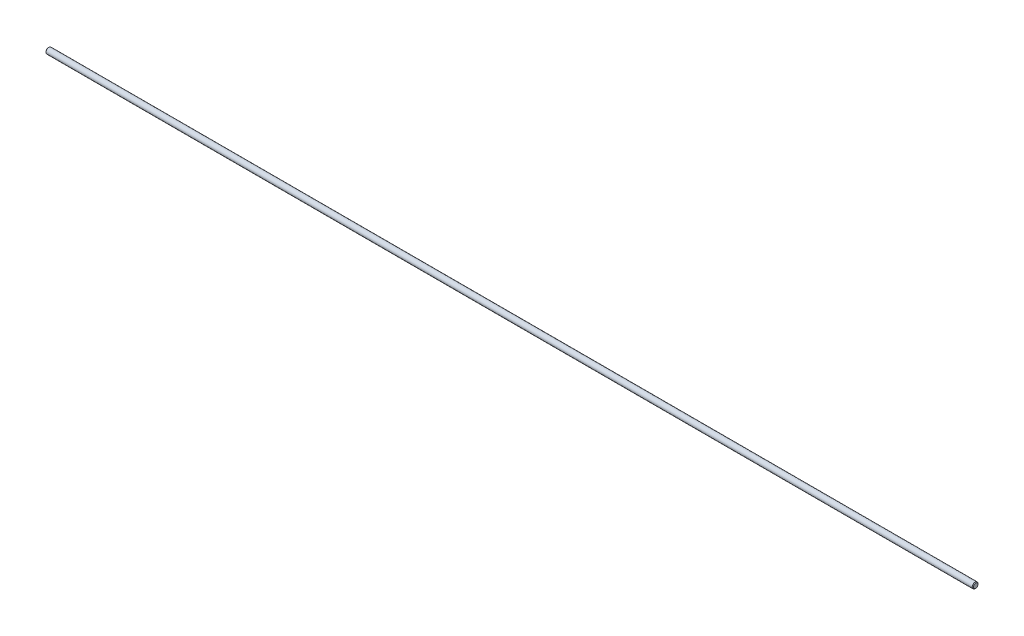
ISO-10303-21;
HEADER;
FILE_DESCRIPTION(('STEP AP214'),'2;1');
FILE_NAME('part.step','',(''),(''),'','','');
FILE_SCHEMA(('AUTOMOTIVE_DESIGN { 1 0 10303 214 1 1 1 1 }'));
ENDSEC;
DATA;
#1=APPLICATION_CONTEXT('core data for automotive mechanical design processes');
#2=APPLICATION_PROTOCOL_DEFINITION('international standard','automotive_design',2000,#1);
#3=PRODUCT_CONTEXT('',#1,'mechanical');
#4=PRODUCT('Part','Part','',(#3));
#5=PRODUCT_RELATED_PRODUCT_CATEGORY('part','',(#4));
#6=PRODUCT_DEFINITION_FORMATION('','',#4);
#7=PRODUCT_DEFINITION_CONTEXT('part definition',#1,'design');
#8=PRODUCT_DEFINITION('design','',#6,#7);
#9=PRODUCT_DEFINITION_SHAPE('','',#8);
#10=(LENGTH_UNIT() NAMED_UNIT(*) SI_UNIT(.MILLI.,.METRE.));
#11=(NAMED_UNIT(*) PLANE_ANGLE_UNIT() SI_UNIT($,.RADIAN.));
#12=(NAMED_UNIT(*) SI_UNIT($,.STERADIAN.) SOLID_ANGLE_UNIT());
#13=UNCERTAINTY_MEASURE_WITH_UNIT(LENGTH_MEASURE(1.E-05),#10,'distance_accuracy_value','');
#14=(GEOMETRIC_REPRESENTATION_CONTEXT(3) GLOBAL_UNCERTAINTY_ASSIGNED_CONTEXT((#13)) GLOBAL_UNIT_ASSIGNED_CONTEXT((#10,
#11,#12)) REPRESENTATION_CONTEXT('',''));
#15=CARTESIAN_POINT('',(0.,0.,0.));
#16=DIRECTION('',(0.,0.,1.));
#17=DIRECTION('',(1.,0.,0.));
#18=AXIS2_PLACEMENT_3D('',#15,#16,#17);
#19=CARTESIAN_POINT('',(-762.,0.,0.));
#20=DIRECTION('',(1.,0.,0.));
#21=DIRECTION('',(0.,0.,-1.));
#22=AXIS2_PLACEMENT_3D('',#19,#20,#21);
#23=CYLINDRICAL_SURFACE('',#22,4.7625);
#24=CARTESIAN_POINT('',(761.0475,0.,0.));
#25=DIRECTION('',(1.,0.,0.));
#26=DIRECTION('',(0.,0.,-1.));
#27=AXIS2_PLACEMENT_3D('',#24,#25,#26);
#28=CIRCLE('',#27,4.7625);
#29=CARTESIAN_POINT('',(761.0475,0.,4.76250000000006));
#30=VERTEX_POINT('',#29);
#31=EDGE_CURVE('E36',#30,#30,#28,.F.);
#32=ORIENTED_EDGE('',*,*,#31,.T.);
#33=EDGE_LOOP('',(#32));
#34=FACE_BOUND('',#33,.T.);
#35=CARTESIAN_POINT('',(-761.0475,0.,0.));
#36=DIRECTION('',(1.,0.,0.));
#37=DIRECTION('',(0.,0.,-1.));
#38=AXIS2_PLACEMENT_3D('',#35,#36,#37);
#39=CIRCLE('',#38,4.7625);
#40=CARTESIAN_POINT('',(-761.0475,0.,-4.7625));
#41=VERTEX_POINT('',#40);
#42=EDGE_CURVE('E40',#41,#41,#39,.T.);
#43=ORIENTED_EDGE('',*,*,#42,.T.);
#44=EDGE_LOOP('',(#43));
#45=FACE_BOUND('',#44,.T.);
#46=ADVANCED_FACE('F29',(#34,#45),#23,.T.);
#47=CARTESIAN_POINT('',(-762.,0.,0.));
#48=DIRECTION('',(1.,0.,0.));
#49=DIRECTION('',(0.,0.,-1.));
#50=AXIS2_PLACEMENT_3D('',#47,#48,#49);
#51=PLANE('',#50);
#52=CARTESIAN_POINT('',(-762.,0.,0.));
#53=DIRECTION('',(1.,0.,0.));
#54=DIRECTION('',(0.,0.,-1.));
#55=AXIS2_PLACEMENT_3D('',#52,#53,#54);
#56=CIRCLE('',#55,3.81000000000009);
#57=CARTESIAN_POINT('',(-762.,0.,-3.81000000000009));
#58=VERTEX_POINT('',#57);
#59=EDGE_CURVE('E10',#58,#58,#56,.F.);
#60=ORIENTED_EDGE('',*,*,#59,.T.);
#61=EDGE_LOOP('',(#60));
#62=FACE_BOUND('',#61,.T.);
#63=ADVANCED_FACE('F60',(#62),#51,.F.);
#64=CARTESIAN_POINT('',(762.,0.,0.));
#65=DIRECTION('',(1.,0.,0.));
#66=DIRECTION('',(0.,0.,-1.));
#67=AXIS2_PLACEMENT_3D('',#64,#65,#66);
#68=PLANE('',#67);
#69=CARTESIAN_POINT('',(762.,0.,0.));
#70=DIRECTION('',(1.,0.,0.));
#71=DIRECTION('',(0.,0.,-1.));
#72=AXIS2_PLACEMENT_3D('',#69,#70,#71);
#73=CIRCLE('',#72,3.80999999999987);
#74=CARTESIAN_POINT('',(762.,0.,3.80999999999992));
#75=VERTEX_POINT('',#74);
#76=EDGE_CURVE('E44',#75,#75,#73,.T.);
#77=ORIENTED_EDGE('',*,*,#76,.T.);
#78=EDGE_LOOP('',(#77));
#79=FACE_BOUND('',#78,.T.);
#80=ADVANCED_FACE('F50',(#79),#68,.T.);
#81=CARTESIAN_POINT('',(762.,0.,0.));
#82=DIRECTION('',(-1.,0.,0.));
#83=DIRECTION('',(0.,0.,1.));
#84=AXIS2_PLACEMENT_3D('',#81,#82,#83);
#85=CONICAL_SURFACE('',#84,3.80999999999987,0.785398163397447);
#86=CARTESIAN_POINT('',(761.0475,0.,4.76250000000006));
#87=CARTESIAN_POINT('',(761.057421875,0.,4.75257812500005));
#88=CARTESIAN_POINT('',(761.06734375,0.,4.74265625000005));
#89=CARTESIAN_POINT('',(761.0871875,0.,4.72281250000005));
#90=CARTESIAN_POINT('',(761.097109375,0.,4.71289062500005));
#91=CARTESIAN_POINT('',(761.116953125,0.,4.69304687500005));
#92=CARTESIAN_POINT('',(761.126875,0.,4.68312500000004));
#93=CARTESIAN_POINT('',(761.14671875,0.,4.66328125000004));
#94=CARTESIAN_POINT('',(761.156640625,0.,4.65335937500004));
#95=CARTESIAN_POINT('',(761.176484375,0.,4.63351562500004));
#96=CARTESIAN_POINT('',(761.18640625,0.,4.62359375000004));
#97=CARTESIAN_POINT('',(761.20625,0.,4.60375000000003));
#98=CARTESIAN_POINT('',(761.216171875,0.,4.59382812500003));
#99=CARTESIAN_POINT('',(761.236015625,0.,4.57398437500003));
#100=CARTESIAN_POINT('',(761.2459375,0.,4.56406250000003));
#101=CARTESIAN_POINT('',(761.26578125,0.,4.54421875000002));
#102=CARTESIAN_POINT('',(761.275703125,0.,4.53429687500002));
#103=CARTESIAN_POINT('',(761.295546875,0.,4.51445312500002));
#104=CARTESIAN_POINT('',(761.30546875,0.,4.50453125000002));
#105=CARTESIAN_POINT('',(761.3253125,0.,4.48468750000002));
#106=CARTESIAN_POINT('',(761.335234375,0.,4.47476562500002));
#107=CARTESIAN_POINT('',(761.355078125,0.,4.45492187500001));
#108=CARTESIAN_POINT('',(761.365,0.,4.44500000000001));
#109=CARTESIAN_POINT('',(761.38484375,0.,4.42515625000001));
#110=CARTESIAN_POINT('',(761.394765625,0.,4.41523437500001));
#111=CARTESIAN_POINT('',(761.414609375,0.,4.39539062500001));
#112=CARTESIAN_POINT('',(761.42453125,0.,4.38546875));
#113=CARTESIAN_POINT('',(761.444375,0.,4.365625));
#114=CARTESIAN_POINT('',(761.454296875,0.,4.355703125));
#115=CARTESIAN_POINT('',(761.474140625,0.,4.335859375));
#116=CARTESIAN_POINT('',(761.4840625,0.,4.32593750000001));
#117=CARTESIAN_POINT('',(761.50390625,0.,4.30609375));
#118=CARTESIAN_POINT('',(761.513828125,0.,4.29617187499998));
#119=CARTESIAN_POINT('',(761.533671875,0.,4.27632812499998));
#120=CARTESIAN_POINT('',(761.54359375,0.,4.26640624999998));
#121=CARTESIAN_POINT('',(761.5634375,0.,4.24656249999999));
#122=CARTESIAN_POINT('',(761.573359375,0.,4.23664062499998));
#123=CARTESIAN_POINT('',(761.593203125,0.,4.21679687499998));
#124=CARTESIAN_POINT('',(761.603125,0.,4.20687499999998));
#125=CARTESIAN_POINT('',(761.62296875,0.,4.18703124999998));
#126=CARTESIAN_POINT('',(761.632890625,0.,4.17710937499997));
#127=CARTESIAN_POINT('',(761.652734375,0.,4.15726562499997));
#128=CARTESIAN_POINT('',(761.66265625,0.,4.14734374999997));
#129=CARTESIAN_POINT('',(761.6825,0.,4.12749999999997));
#130=CARTESIAN_POINT('',(761.692421875,0.,4.11757812499997));
#131=CARTESIAN_POINT('',(761.712265625,0.,4.09773437499996));
#132=CARTESIAN_POINT('',(761.7221875,0.,4.08781249999996));
#133=CARTESIAN_POINT('',(761.74203125,0.,4.06796874999996));
#134=CARTESIAN_POINT('',(761.751953125,0.,4.05804687499996));
#135=CARTESIAN_POINT('',(761.771796875,0.,4.03820312499996));
#136=CARTESIAN_POINT('',(761.78171875,0.,4.02828124999995));
#137=CARTESIAN_POINT('',(761.8015625,0.,4.00843749999995));
#138=CARTESIAN_POINT('',(761.811484375,0.,3.99851562499995));
#139=CARTESIAN_POINT('',(761.831328125,0.,3.97867187499995));
#140=CARTESIAN_POINT('',(761.84125,0.,3.96874999999995));
#141=CARTESIAN_POINT('',(761.86109375,0.,3.94890624999994));
#142=CARTESIAN_POINT('',(761.871015625,0.,3.93898437499994));
#143=CARTESIAN_POINT('',(761.890859375,0.,3.91914062499994));
#144=CARTESIAN_POINT('',(761.90078125,0.,3.90921874999994));
#145=CARTESIAN_POINT('',(761.920625,0.,3.88937499999994));
#146=CARTESIAN_POINT('',(761.930546875,0.,3.87945312499993));
#147=CARTESIAN_POINT('',(761.950390625,0.,3.85960937499993));
#148=CARTESIAN_POINT('',(761.9603125,0.,3.84968749999993));
#149=CARTESIAN_POINT('',(761.98015625,0.,3.82984374999993));
#150=CARTESIAN_POINT('',(761.990078125,0.,3.81992187499993));
#151=CARTESIAN_POINT('',(762.,0.,3.80999999999992));
#152=B_SPLINE_CURVE_WITH_KNOTS('',3,(#86,#87,#88,#89,#90,#91,#92,#93,#94,#95,#96,#97,#98,#99,
#100,#101,#102,#103,#104,#105,#106,#107,#108,#109,#110,#111,#112,#113,#114,#115,#116,#117,#118,
#119,#120,#121,#122,#123,#124,#125,#126,#127,#128,#129,#130,#131,#132,#133,#134,#135,#136,#137,
#138,#139,#140,#141,#142,#143,#144,#145,#146,#147,#148,#149,#150,#151),.UNSPECIFIED.,.F.,.F.,(4,
2,2,2,2,2,2,2,2,2,2,2,2,2,2,2,2,2,2,2,2,2,2,2,2,2,2,2,2,2,2,2,4),(0.,0.0420949505675225,
0.0841899011350449,0.126284851702567,0.168379802270089,0.210474752837612,0.252569703405134,
0.294664653972657,0.336759604540179,0.378854555107702,0.420949505675224,0.463044456242746,
0.505139406810269,0.547234357377791,0.589329307945314,0.631424258512836,0.67351920908028,
0.715614159647803,0.757709110215325,0.799804060782847,0.841899011350369,0.883993961917892,
0.926088912485414,0.968183863052937,1.01027881362046,1.05237376418798,1.0944687147555,
1.13656366532303,1.17865861589055,1.22075356645807,1.26284851702559,1.30494346759312,
1.34703841816064),.UNSPECIFIED.);
#153=EDGE_CURVE('BSEAM52',#30,#75,#152,.T.);
#154=ORIENTED_EDGE('',*,*,#31,.F.);
#155=ORIENTED_EDGE('',*,*,#76,.F.);
#156=ORIENTED_EDGE('',*,*,#153,.T.);
#157=ORIENTED_EDGE('',*,*,#153,.F.);
#158=EDGE_LOOP('',(#154,#156,#155,#157));
#159=FACE_BOUND('',#158,.T.);
#160=ADVANCED_FACE('F52',(#159),#85,.T.);
#161=CARTESIAN_POINT('',(-761.0475,0.,0.));
#162=DIRECTION('',(1.,0.,0.));
#163=DIRECTION('',(0.,0.,-1.));
#164=AXIS2_PLACEMENT_3D('',#161,#162,#163);
#165=CONICAL_SURFACE('',#164,4.7625,0.785398163397447);
#166=ORIENTED_EDGE('',*,*,#59,.F.);
#167=EDGE_LOOP('',(#166));
#168=FACE_BOUND('',#167,.T.);
#169=ORIENTED_EDGE('',*,*,#42,.F.);
#170=EDGE_LOOP('',(#169));
#171=FACE_BOUND('',#170,.T.);
#172=ADVANCED_FACE('F31',(#168,#171),#165,.T.);
#173=CLOSED_SHELL('',(#46,#63,#80,#160,#172));
#174=MANIFOLD_SOLID_BREP('B2',#173);
#175=ADVANCED_BREP_SHAPE_REPRESENTATION('',(#18,#174),#14);
#176=SHAPE_DEFINITION_REPRESENTATION(#9,#175);
ENDSEC;
END-ISO-10303-21;
